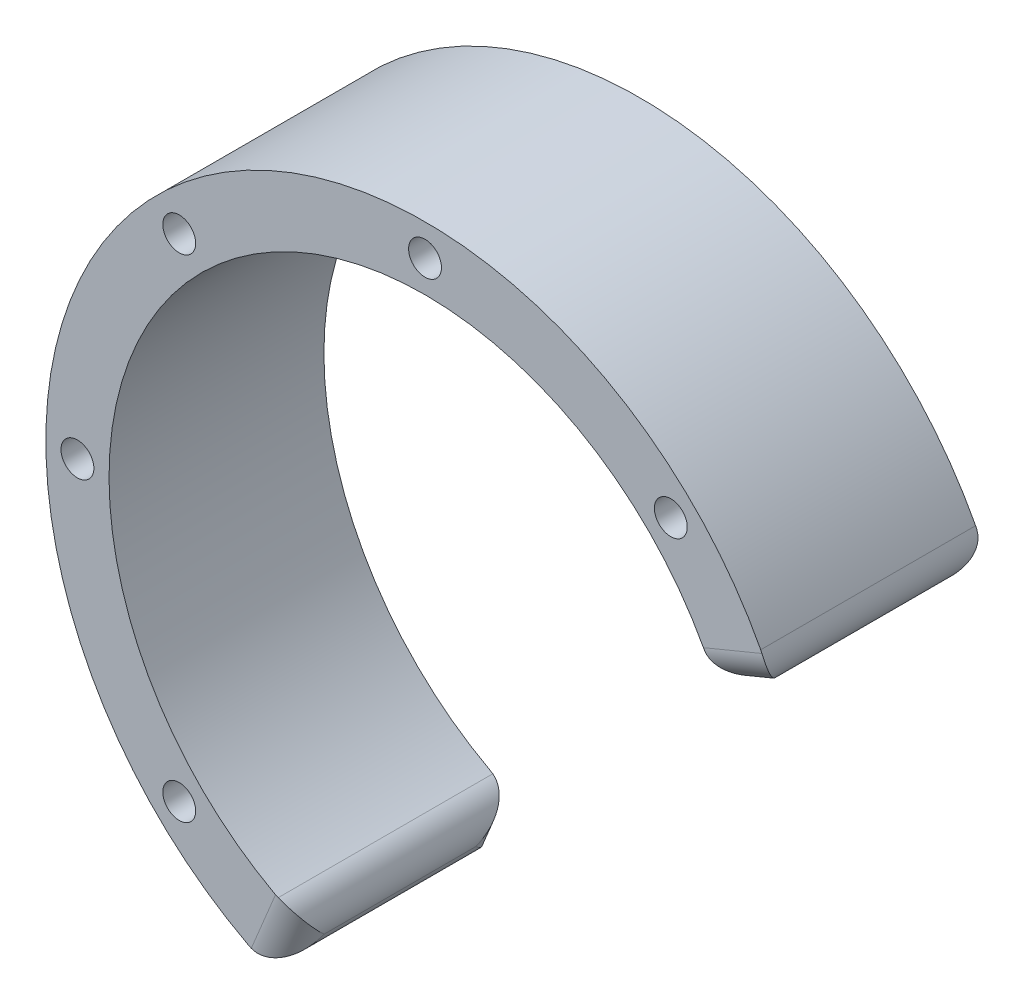
ISO-10303-21;
HEADER;
FILE_DESCRIPTION(('STEP AP214'),'2;1');
FILE_NAME('part.step','',(''),(''),'','','');
FILE_SCHEMA(('AUTOMOTIVE_DESIGN { 1 0 10303 214 1 1 1 1 }'));
ENDSEC;
DATA;
#1=APPLICATION_CONTEXT('core data for automotive mechanical design processes');
#2=APPLICATION_PROTOCOL_DEFINITION('international standard','automotive_design',2000,#1);
#3=PRODUCT_CONTEXT('',#1,'mechanical');
#4=PRODUCT('Part','Part','',(#3));
#5=PRODUCT_RELATED_PRODUCT_CATEGORY('part','',(#4));
#6=PRODUCT_DEFINITION_FORMATION('','',#4);
#7=PRODUCT_DEFINITION_CONTEXT('part definition',#1,'design');
#8=PRODUCT_DEFINITION('design','',#6,#7);
#9=PRODUCT_DEFINITION_SHAPE('','',#8);
#10=(LENGTH_UNIT() NAMED_UNIT(*) SI_UNIT(.MILLI.,.METRE.));
#11=(NAMED_UNIT(*) PLANE_ANGLE_UNIT() SI_UNIT($,.RADIAN.));
#12=(NAMED_UNIT(*) SI_UNIT($,.STERADIAN.) SOLID_ANGLE_UNIT());
#13=UNCERTAINTY_MEASURE_WITH_UNIT(LENGTH_MEASURE(1.E-05),#10,'distance_accuracy_value','');
#14=(GEOMETRIC_REPRESENTATION_CONTEXT(3) GLOBAL_UNCERTAINTY_ASSIGNED_CONTEXT((#13)) GLOBAL_UNIT_ASSIGNED_CONTEXT((#10,
#11,#12)) REPRESENTATION_CONTEXT('',''));
#15=CARTESIAN_POINT('',(0.,0.,0.));
#16=DIRECTION('',(0.,0.,1.));
#17=DIRECTION('',(1.,0.,0.));
#18=AXIS2_PLACEMENT_3D('',#15,#16,#17);
#19=CARTESIAN_POINT('',(0.,0.,34.));
#20=DIRECTION('',(0.,0.,1.));
#21=DIRECTION('',(1.,0.,0.));
#22=AXIS2_PLACEMENT_3D('',#19,#20,#21);
#23=PLANE('',#22);
#24=CARTESIAN_POINT('',(-55.,0.,34.));
#25=DIRECTION('',(0.,0.,1.));
#26=DIRECTION('',(1.,0.,0.));
#27=AXIS2_PLACEMENT_3D('',#24,#25,#26);
#28=CIRCLE('',#27,2.6);
#29=CARTESIAN_POINT('',(-52.4,0.,34.));
#30=VERTEX_POINT('',#29);
#31=EDGE_CURVE('E267',#30,#30,#28,.T.);
#32=ORIENTED_EDGE('',*,*,#31,.F.);
#33=EDGE_LOOP('',(#32));
#34=FACE_BOUND('',#33,.T.);
#35=CARTESIAN_POINT('',(0.,55.,34.));
#36=DIRECTION('',(0.,0.,1.));
#37=DIRECTION('',(1.,0.,0.));
#38=AXIS2_PLACEMENT_3D('',#35,#36,#37);
#39=CIRCLE('',#38,2.6);
#40=CARTESIAN_POINT('',(2.6,55.,34.));
#41=VERTEX_POINT('',#40);
#42=EDGE_CURVE('E148',#41,#41,#39,.T.);
#43=ORIENTED_EDGE('',*,*,#42,.F.);
#44=EDGE_LOOP('',(#43));
#45=FACE_BOUND('',#44,.T.);
#46=CARTESIAN_POINT('',(38.8908729652601,38.8908729652601,34.));
#47=DIRECTION('',(0.,0.,1.));
#48=DIRECTION('',(1.,0.,0.));
#49=AXIS2_PLACEMENT_3D('',#46,#47,#48);
#50=CIRCLE('',#49,2.6);
#51=CARTESIAN_POINT('',(41.4908729652601,38.8908729652601,34.));
#52=VERTEX_POINT('',#51);
#53=EDGE_CURVE('E215',#52,#52,#50,.T.);
#54=ORIENTED_EDGE('',*,*,#53,.F.);
#55=EDGE_LOOP('',(#54));
#56=FACE_BOUND('',#55,.T.);
#57=CARTESIAN_POINT('',(-38.8908729652601,-38.8908729652601,34.));
#58=DIRECTION('',(0.,0.,1.));
#59=DIRECTION('',(1.,0.,0.));
#60=AXIS2_PLACEMENT_3D('',#57,#58,#59);
#61=CIRCLE('',#60,2.6);
#62=CARTESIAN_POINT('',(-36.2908729652601,-38.8908729652601,34.));
#63=VERTEX_POINT('',#62);
#64=EDGE_CURVE('E200',#63,#63,#61,.T.);
#65=ORIENTED_EDGE('',*,*,#64,.F.);
#66=EDGE_LOOP('',(#65));
#67=FACE_BOUND('',#66,.T.);
#68=CARTESIAN_POINT('',(-38.8908729652601,38.8908729652601,34.));
#69=DIRECTION('',(0.,0.,1.));
#70=DIRECTION('',(1.,0.,0.));
#71=AXIS2_PLACEMENT_3D('',#68,#69,#70);
#72=CIRCLE('',#71,2.6);
#73=CARTESIAN_POINT('',(-36.2908729652601,38.8908729652601,34.));
#74=VERTEX_POINT('',#73);
#75=EDGE_CURVE('E163',#74,#74,#72,.T.);
#76=ORIENTED_EDGE('',*,*,#75,.F.);
#77=EDGE_LOOP('',(#76));
#78=FACE_BOUND('',#77,.T.);
#79=DIRECTION('',(0.923879532511288,0.382683432365087,0.));
#80=VECTOR('',#79,1.);
#81=CARTESIAN_POINT('',(-1.91341716182544,4.61939766255644,34.));
#82=LINE('',#81,#80);
#83=CARTESIAN_POINT('',(44.049009250608,23.6576580421616,34.));
#84=VERTEX_POINT('',#83);
#85=CARTESIAN_POINT('',(53.308946538107,27.493249653368,34.));
#86=VERTEX_POINT('',#85);
#87=EDGE_CURVE('E171',#84,#86,#82,.T.);
#88=ORIENTED_EDGE('',*,*,#87,.T.);
#89=CARTESIAN_POINT('',(48.6895488755505,25.5798324915425,34.));
#90=DIRECTION('',(0.,0.,1.));
#91=DIRECTION('',(1.,0.,0.));
#92=AXIS2_PLACEMENT_3D('',#89,#90,#91);
#93=CIRCLE('',#92,5.);
#94=CARTESIAN_POINT('',(53.1158715006006,27.9052718089555,34.));
#95=VERTEX_POINT('',#94);
#96=EDGE_CURVE('E211',#86,#95,#93,.T.);
#97=ORIENTED_EDGE('',*,*,#96,.T.);
#98=CARTESIAN_POINT('',(0.,0.,34.));
#99=DIRECTION('',(0.,0.,1.));
#100=DIRECTION('',(1.,0.,0.));
#101=AXIS2_PLACEMENT_3D('',#98,#99,#100);
#102=CIRCLE('',#101,60.);
#103=CARTESIAN_POINT('',(-27.9052718089557,-53.1158715006005,34.));
#104=VERTEX_POINT('',#103);
#105=EDGE_CURVE('E197',#95,#104,#102,.T.);
#106=ORIENTED_EDGE('',*,*,#105,.T.);
#107=CARTESIAN_POINT('',(-25.5798324915427,-48.6895488755505,34.));
#108=DIRECTION('',(0.,0.,1.));
#109=DIRECTION('',(1.,0.,0.));
#110=AXIS2_PLACEMENT_3D('',#107,#108,#109);
#111=CIRCLE('',#110,5.);
#112=CARTESIAN_POINT('',(-27.4932496533681,-53.3089465381069,34.));
#113=VERTEX_POINT('',#112);
#114=EDGE_CURVE('E168',#104,#113,#111,.T.);
#115=ORIENTED_EDGE('',*,*,#114,.T.);
#116=DIRECTION('',(-0.382683432365091,-0.923879532511287,0.));
#117=VECTOR('',#116,1.);
#118=CARTESIAN_POINT('',(-23.753569280811,-44.2805594637389,34.));
#119=LINE('',#118,#117);
#120=CARTESIAN_POINT('',(-23.6576580421617,-44.0490092506079,34.));
#121=VERTEX_POINT('',#120);
#122=EDGE_CURVE('E172',#113,#121,#119,.F.);
#123=ORIENTED_EDGE('',*,*,#122,.T.);
#124=CARTESIAN_POINT('',(0.,0.,34.));
#125=DIRECTION('',(0.,0.,1.));
#126=DIRECTION('',(1.,0.,0.));
#127=AXIS2_PLACEMENT_3D('',#124,#125,#126);
#128=CIRCLE('',#127,50.);
#129=EDGE_CURVE('E164',#84,#121,#128,.T.);
#130=ORIENTED_EDGE('',*,*,#129,.F.);
#131=EDGE_LOOP('',(#88,#97,#106,#115,#123,#130));
#132=FACE_BOUND('',#131,.T.);
#133=ADVANCED_FACE('F47',(#34,#45,#56,#67,#78,#132),#23,.T.);
#134=CARTESIAN_POINT('',(0.,0.,0.));
#135=DIRECTION('',(0.,0.,1.));
#136=DIRECTION('',(1.,0.,0.));
#137=AXIS2_PLACEMENT_3D('',#134,#135,#136);
#138=PLANE('',#137);
#139=CARTESIAN_POINT('',(-38.8908729652601,38.8908729652601,0.));
#140=DIRECTION('',(0.,0.,1.));
#141=DIRECTION('',(1.,0.,0.));
#142=AXIS2_PLACEMENT_3D('',#139,#140,#141);
#143=CIRCLE('',#142,2.6);
#144=CARTESIAN_POINT('',(-36.2908729652601,38.8908729652601,0.));
#145=VERTEX_POINT('',#144);
#146=EDGE_CURVE('E159',#145,#145,#143,.T.);
#147=ORIENTED_EDGE('',*,*,#146,.T.);
#148=EDGE_LOOP('',(#147));
#149=FACE_BOUND('',#148,.T.);
#150=CARTESIAN_POINT('',(-55.,0.,0.));
#151=DIRECTION('',(0.,0.,1.));
#152=DIRECTION('',(1.,0.,0.));
#153=AXIS2_PLACEMENT_3D('',#150,#151,#152);
#154=CIRCLE('',#153,2.6);
#155=CARTESIAN_POINT('',(-52.4,0.,0.));
#156=VERTEX_POINT('',#155);
#157=EDGE_CURVE('E265',#156,#156,#154,.T.);
#158=ORIENTED_EDGE('',*,*,#157,.T.);
#159=EDGE_LOOP('',(#158));
#160=FACE_BOUND('',#159,.T.);
#161=CARTESIAN_POINT('',(-38.8908729652601,-38.8908729652601,0.));
#162=DIRECTION('',(0.,0.,1.));
#163=DIRECTION('',(1.,0.,0.));
#164=AXIS2_PLACEMENT_3D('',#161,#162,#163);
#165=CIRCLE('',#164,2.6);
#166=CARTESIAN_POINT('',(-36.2908729652601,-38.8908729652601,0.));
#167=VERTEX_POINT('',#166);
#168=EDGE_CURVE('E205',#167,#167,#165,.T.);
#169=ORIENTED_EDGE('',*,*,#168,.T.);
#170=EDGE_LOOP('',(#169));
#171=FACE_BOUND('',#170,.T.);
#172=CARTESIAN_POINT('',(38.8908729652601,38.8908729652601,0.));
#173=DIRECTION('',(0.,0.,1.));
#174=DIRECTION('',(1.,0.,0.));
#175=AXIS2_PLACEMENT_3D('',#172,#173,#174);
#176=CIRCLE('',#175,2.6);
#177=CARTESIAN_POINT('',(41.4908729652601,38.8908729652601,0.));
#178=VERTEX_POINT('',#177);
#179=EDGE_CURVE('E204',#178,#178,#176,.T.);
#180=ORIENTED_EDGE('',*,*,#179,.T.);
#181=EDGE_LOOP('',(#180));
#182=FACE_BOUND('',#181,.T.);
#183=CARTESIAN_POINT('',(0.,55.,0.));
#184=DIRECTION('',(0.,0.,1.));
#185=DIRECTION('',(1.,0.,0.));
#186=AXIS2_PLACEMENT_3D('',#183,#184,#185);
#187=CIRCLE('',#186,2.6);
#188=CARTESIAN_POINT('',(2.6,55.,0.));
#189=VERTEX_POINT('',#188);
#190=EDGE_CURVE('E152',#189,#189,#187,.T.);
#191=ORIENTED_EDGE('',*,*,#190,.T.);
#192=EDGE_LOOP('',(#191));
#193=FACE_BOUND('',#192,.T.);
#194=CARTESIAN_POINT('',(0.,0.,0.));
#195=DIRECTION('',(0.,0.,1.));
#196=DIRECTION('',(1.,0.,0.));
#197=AXIS2_PLACEMENT_3D('',#194,#195,#196);
#198=CIRCLE('',#197,60.);
#199=CARTESIAN_POINT('',(53.1158715006006,27.9052718089555,0.));
#200=VERTEX_POINT('',#199);
#201=CARTESIAN_POINT('',(-27.9052718089557,-53.1158715006005,0.));
#202=VERTEX_POINT('',#201);
#203=EDGE_CURVE('E151',#200,#202,#198,.T.);
#204=ORIENTED_EDGE('',*,*,#203,.F.);
#205=CARTESIAN_POINT('',(48.6895488755505,25.5798324915425,0.));
#206=DIRECTION('',(0.,0.,1.));
#207=DIRECTION('',(1.,0.,0.));
#208=AXIS2_PLACEMENT_3D('',#205,#206,#207);
#209=CIRCLE('',#208,5.);
#210=CARTESIAN_POINT('',(53.308946538107,27.493249653368,0.));
#211=VERTEX_POINT('',#210);
#212=EDGE_CURVE('E139',#200,#211,#209,.F.);
#213=ORIENTED_EDGE('',*,*,#212,.T.);
#214=DIRECTION('',(0.923879532511288,0.382683432365087,0.));
#215=VECTOR('',#214,1.);
#216=CARTESIAN_POINT('',(44.280559463739,23.7535692808108,0.));
#217=LINE('',#216,#215);
#218=CARTESIAN_POINT('',(44.049009250608,23.6576580421616,0.));
#219=VERTEX_POINT('',#218);
#220=EDGE_CURVE('E144',#211,#219,#217,.F.);
#221=ORIENTED_EDGE('',*,*,#220,.T.);
#222=CARTESIAN_POINT('',(0.,0.,0.));
#223=DIRECTION('',(0.,0.,1.));
#224=DIRECTION('',(1.,0.,0.));
#225=AXIS2_PLACEMENT_3D('',#222,#223,#224);
#226=CIRCLE('',#225,50.);
#227=CARTESIAN_POINT('',(-23.6576580421617,-44.0490092506079,0.));
#228=VERTEX_POINT('',#227);
#229=EDGE_CURVE('E243',#219,#228,#226,.T.);
#230=ORIENTED_EDGE('',*,*,#229,.T.);
#231=DIRECTION('',(-0.382683432365091,-0.923879532511287,0.));
#232=VECTOR('',#231,1.);
#233=CARTESIAN_POINT('',(-4.61939766255643,1.91341716182545,0.));
#234=LINE('',#233,#232);
#235=CARTESIAN_POINT('',(-27.4932496533681,-53.3089465381069,0.));
#236=VERTEX_POINT('',#235);
#237=EDGE_CURVE('E287',#228,#236,#234,.T.);
#238=ORIENTED_EDGE('',*,*,#237,.T.);
#239=CARTESIAN_POINT('',(-25.5798324915427,-48.6895488755505,0.));
#240=DIRECTION('',(0.,0.,1.));
#241=DIRECTION('',(1.,0.,0.));
#242=AXIS2_PLACEMENT_3D('',#239,#240,#241);
#243=CIRCLE('',#242,5.);
#244=EDGE_CURVE('E98',#236,#202,#243,.F.);
#245=ORIENTED_EDGE('',*,*,#244,.T.);
#246=EDGE_LOOP('',(#204,#213,#221,#230,#238,#245));
#247=FACE_BOUND('',#246,.T.);
#248=ADVANCED_FACE('F310',(#149,#160,#171,#182,#193,#247),#138,.F.);
#249=CARTESIAN_POINT('',(0.,0.,34.));
#250=DIRECTION('',(0.,0.,-1.));
#251=DIRECTION('',(-1.,0.,0.));
#252=AXIS2_PLACEMENT_3D('',#249,#250,#251);
#253=CYLINDRICAL_SURFACE('',#252,60.);
#254=ORIENTED_EDGE('',*,*,#105,.F.);
#255=DIRECTION('',(0.,0.,-1.));
#256=VECTOR('',#255,1.);
#257=CARTESIAN_POINT('',(53.1158715006006,27.9052718089555,34.));
#258=LINE('',#257,#256);
#259=EDGE_CURVE('E131',#95,#200,#258,.T.);
#260=ORIENTED_EDGE('',*,*,#259,.T.);
#261=ORIENTED_EDGE('',*,*,#203,.T.);
#262=DIRECTION('',(0.,0.,-1.));
#263=VECTOR('',#262,1.);
#264=CARTESIAN_POINT('',(-27.9052718089557,-53.1158715006005,34.));
#265=LINE('',#264,#263);
#266=EDGE_CURVE('E135',#202,#104,#265,.F.);
#267=ORIENTED_EDGE('',*,*,#266,.T.);
#268=EDGE_LOOP('',(#254,#260,#261,#267));
#269=FACE_BOUND('',#268,.T.);
#270=ADVANCED_FACE('F316',(#269),#253,.T.);
#271=CARTESIAN_POINT('',(0.,0.,34.));
#272=DIRECTION('',(0.,0.,-1.));
#273=DIRECTION('',(-1.,0.,0.));
#274=AXIS2_PLACEMENT_3D('',#271,#272,#273);
#275=CYLINDRICAL_SURFACE('',#274,50.);
#276=ORIENTED_EDGE('',*,*,#229,.F.);
#277=CARTESIAN_POINT('',(44.049009250608,23.6576580421616,0.));
#278=CARTESIAN_POINT('',(44.0850923837166,23.5904720987774,2.14972934691426E-07));
#279=CARTESIAN_POINT('',(44.1209853669286,23.5232737214159,0.00172565768276111));
#280=CARTESIAN_POINT('',(44.1923910335594,23.3888520987386,0.00862699857619739));
#281=CARTESIAN_POINT('',(44.2279037169783,23.3216288534227,0.0138028967598073));
#282=CARTESIAN_POINT('',(44.2632262505005,23.2543931741296,0.0207040226803089));
#283=B_SPLINE_CURVE_WITH_KNOTS('',3,(#277,#278,#279,#280,#281,#282),.UNSPECIFIED.,.F.,.F.,(4,2,
4),(0.,0.228609159588416,0.457218319176832),.UNSPECIFIED.);
#284=CARTESIAN_POINT('',(44.2632262505005,23.2543931741296,0.0207040226803054));
#285=VERTEX_POINT('',#284);
#286=EDGE_CURVE('E11',#219,#285,#283,.T.);
#287=ORIENTED_EDGE('',*,*,#286,.T.);
#288=DIRECTION('',(0.,0.,-1.));
#289=VECTOR('',#288,1.);
#290=CARTESIAN_POINT('',(44.2632262505005,23.2543931741296,34.));
#291=LINE('',#290,#289);
#292=CARTESIAN_POINT('',(44.2632262505005,23.2543931741296,33.9792959773197));
#293=VERTEX_POINT('',#292);
#294=EDGE_CURVE('E59',#285,#293,#291,.F.);
#295=ORIENTED_EDGE('',*,*,#294,.T.);
#296=CARTESIAN_POINT('',(44.2632262505005,23.2543931741296,33.9792959773197));
#297=CARTESIAN_POINT('',(44.2279037169783,23.3216288534227,33.9861971032402));
#298=CARTESIAN_POINT('',(44.1923910335594,23.3888520987386,33.9913730014238));
#299=CARTESIAN_POINT('',(44.1209853669286,23.5232737214159,33.9982743423172));
#300=CARTESIAN_POINT('',(44.0850923837166,23.5904720987774,33.9999997850271));
#301=CARTESIAN_POINT('',(44.049009250608,23.6576580421616,34.));
#302=B_SPLINE_CURVE_WITH_KNOTS('',3,(#296,#297,#298,#299,#300,#301),.UNSPECIFIED.,.F.,.F.,(4,2,
4),(0.,0.228609159588414,0.45721831917683),.UNSPECIFIED.);
#303=EDGE_CURVE('E128',#293,#84,#302,.T.);
#304=ORIENTED_EDGE('',*,*,#303,.T.);
#305=ORIENTED_EDGE('',*,*,#129,.T.);
#306=CARTESIAN_POINT('',(-23.6576580421617,-44.0490092506079,34.));
#307=CARTESIAN_POINT('',(-23.5904720987775,-44.0850923837165,33.9999997850271));
#308=CARTESIAN_POINT('',(-23.5232737214161,-44.1209853669285,33.9982743423172));
#309=CARTESIAN_POINT('',(-23.3888520987387,-44.1923910335594,33.9913730014238));
#310=CARTESIAN_POINT('',(-23.3216288534228,-44.2279037169782,33.9861971032402));
#311=CARTESIAN_POINT('',(-23.2543931741297,-44.2632262505004,33.9792959773197));
#312=B_SPLINE_CURVE_WITH_KNOTS('',3,(#306,#307,#308,#309,#310,#311),.UNSPECIFIED.,.F.,.F.,(4,2,
4),(0.,0.228609159588419,0.457218319176836),.UNSPECIFIED.);
#313=CARTESIAN_POINT('',(-23.2543931741297,-44.2632262505004,33.9792959773197));
#314=VERTEX_POINT('',#313);
#315=EDGE_CURVE('E143',#121,#314,#312,.T.);
#316=ORIENTED_EDGE('',*,*,#315,.T.);
#317=DIRECTION('',(0.,0.,-1.));
#318=VECTOR('',#317,1.);
#319=CARTESIAN_POINT('',(-23.2543931741297,-44.2632262505004,34.));
#320=LINE('',#319,#318);
#321=CARTESIAN_POINT('',(-23.2543931741297,-44.2632262505004,0.0207040226803054));
#322=VERTEX_POINT('',#321);
#323=EDGE_CURVE('E180',#314,#322,#320,.T.);
#324=ORIENTED_EDGE('',*,*,#323,.T.);
#325=CARTESIAN_POINT('',(-23.2543931741297,-44.2632262505004,0.0207040226803054));
#326=CARTESIAN_POINT('',(-23.3216288534228,-44.2279037169782,0.0138028967598055));
#327=CARTESIAN_POINT('',(-23.3888520987387,-44.1923910335594,0.00862699857619675));
#328=CARTESIAN_POINT('',(-23.5232737214161,-44.1209853669285,0.00172565768276146));
#329=CARTESIAN_POINT('',(-23.5904720987775,-44.0850923837165,2.14972935010914E-07));
#330=CARTESIAN_POINT('',(-23.6576580421617,-44.0490092506079,0.));
#331=B_SPLINE_CURVE_WITH_KNOTS('',3,(#325,#326,#327,#328,#329,#330),.UNSPECIFIED.,.F.,.F.,(4,2,
4),(0.,0.228609159588413,0.457218319176832),.UNSPECIFIED.);
#332=EDGE_CURVE('E107',#322,#228,#331,.T.);
#333=ORIENTED_EDGE('',*,*,#332,.T.);
#334=EDGE_LOOP('',(#276,#287,#295,#304,#305,#316,#324,#333));
#335=FACE_BOUND('',#334,.T.);
#336=ADVANCED_FACE('F297',(#335),#275,.F.);
#337=CARTESIAN_POINT('',(0.,55.,34.));
#338=DIRECTION('',(0.,0.,-1.));
#339=DIRECTION('',(-1.,0.,0.));
#340=AXIS2_PLACEMENT_3D('',#337,#338,#339);
#341=CYLINDRICAL_SURFACE('',#340,2.6);
#342=ORIENTED_EDGE('',*,*,#42,.T.);
#343=EDGE_LOOP('',(#342));
#344=FACE_BOUND('',#343,.T.);
#345=ORIENTED_EDGE('',*,*,#190,.F.);
#346=EDGE_LOOP('',(#345));
#347=FACE_BOUND('',#346,.T.);
#348=ADVANCED_FACE('F322',(#344,#347),#341,.F.);
#349=CARTESIAN_POINT('',(38.8908729652601,38.8908729652601,34.));
#350=DIRECTION('',(0.,0.,-1.));
#351=DIRECTION('',(-1.,0.,0.));
#352=AXIS2_PLACEMENT_3D('',#349,#350,#351);
#353=CYLINDRICAL_SURFACE('',#352,2.6);
#354=ORIENTED_EDGE('',*,*,#53,.T.);
#355=EDGE_LOOP('',(#354));
#356=FACE_BOUND('',#355,.T.);
#357=ORIENTED_EDGE('',*,*,#179,.F.);
#358=EDGE_LOOP('',(#357));
#359=FACE_BOUND('',#358,.T.);
#360=ADVANCED_FACE('F402',(#356,#359),#353,.F.);
#361=CARTESIAN_POINT('',(-38.8908729652601,-38.8908729652601,34.));
#362=DIRECTION('',(0.,0.,-1.));
#363=DIRECTION('',(-1.,0.,0.));
#364=AXIS2_PLACEMENT_3D('',#361,#362,#363);
#365=CYLINDRICAL_SURFACE('',#364,2.6);
#366=ORIENTED_EDGE('',*,*,#64,.T.);
#367=EDGE_LOOP('',(#366));
#368=FACE_BOUND('',#367,.T.);
#369=ORIENTED_EDGE('',*,*,#168,.F.);
#370=EDGE_LOOP('',(#369));
#371=FACE_BOUND('',#370,.T.);
#372=ADVANCED_FACE('F396',(#368,#371),#365,.F.);
#373=CARTESIAN_POINT('',(-55.,0.,34.));
#374=DIRECTION('',(0.,0.,-1.));
#375=DIRECTION('',(-1.,0.,0.));
#376=AXIS2_PLACEMENT_3D('',#373,#374,#375);
#377=CYLINDRICAL_SURFACE('',#376,2.6);
#378=ORIENTED_EDGE('',*,*,#31,.T.);
#379=EDGE_LOOP('',(#378));
#380=FACE_BOUND('',#379,.T.);
#381=ORIENTED_EDGE('',*,*,#157,.F.);
#382=EDGE_LOOP('',(#381));
#383=FACE_BOUND('',#382,.T.);
#384=ADVANCED_FACE('F390',(#380,#383),#377,.F.);
#385=CARTESIAN_POINT('',(-38.8908729652601,38.8908729652601,34.));
#386=DIRECTION('',(0.,0.,-1.));
#387=DIRECTION('',(-1.,0.,0.));
#388=AXIS2_PLACEMENT_3D('',#385,#386,#387);
#389=CYLINDRICAL_SURFACE('',#388,2.6);
#390=ORIENTED_EDGE('',*,*,#75,.T.);
#391=EDGE_LOOP('',(#390));
#392=FACE_BOUND('',#391,.T.);
#393=ORIENTED_EDGE('',*,*,#146,.F.);
#394=EDGE_LOOP('',(#393));
#395=FACE_BOUND('',#394,.T.);
#396=ADVANCED_FACE('F385',(#392,#395),#389,.F.);
#397=CARTESIAN_POINT('',(-1.91341716182544,4.61939766255644,5.));
#398=DIRECTION('',(-0.923879532511288,-0.382683432365087,0.));
#399=DIRECTION('',(0.382683432365087,-0.923879532511288,0.));
#400=AXIS2_PLACEMENT_3D('',#397,#398,#399);
#401=CYLINDRICAL_SURFACE('',#400,5.);
#402=CARTESIAN_POINT('',(48.6895488755505,25.5798324915425,5.));
#403=DIRECTION('',(0.653281482438189,0.270598050073097,-0.707106781186547));
#404=DIRECTION('',(-0.653281482438189,-0.270598050073097,-0.707106781186547));
#405=AXIS2_PLACEMENT_3D('',#402,#403,#404);
#406=ELLIPSE('',#405,7.07106781186547,5.);
#407=CARTESIAN_POINT('',(50.602966037376,20.9604348289861,5.));
#408=VERTEX_POINT('',#407);
#409=EDGE_CURVE('E241',#285,#408,#406,.F.);
#410=ORIENTED_EDGE('',*,*,#409,.F.);
#411=ORIENTED_EDGE('',*,*,#286,.F.);
#412=ORIENTED_EDGE('',*,*,#220,.F.);
#413=CARTESIAN_POINT('',(48.6895488755505,25.5798324915425,5.));
#414=DIRECTION('',(-0.653281482438189,-0.270598050073097,-0.707106781186547));
#415=DIRECTION('',(-0.653281482438189,-0.270598050073097,0.707106781186547));
#416=AXIS2_PLACEMENT_3D('',#413,#414,#415);
#417=ELLIPSE('',#416,7.07106781186547,5.);
#418=EDGE_CURVE('E183',#408,#211,#417,.F.);
#419=ORIENTED_EDGE('',*,*,#418,.F.);
#420=EDGE_LOOP('',(#410,#411,#412,#419));
#421=FACE_BOUND('',#420,.T.);
#422=ADVANCED_FACE('F383',(#421),#401,.T.);
#423=CARTESIAN_POINT('',(48.6895488755505,25.5798324915425,34.));
#424=DIRECTION('',(0.,0.,-1.));
#425=DIRECTION('',(-1.,0.,0.));
#426=AXIS2_PLACEMENT_3D('',#423,#424,#425);
#427=CYLINDRICAL_SURFACE('',#426,5.);
#428=CARTESIAN_POINT('',(48.6895488755505,25.5798324915425,29.));
#429=DIRECTION('',(0.653281482438189,0.270598050073097,0.707106781186547));
#430=DIRECTION('',(0.653281482438189,0.270598050073097,-0.707106781186547));
#431=AXIS2_PLACEMENT_3D('',#428,#429,#430);
#432=ELLIPSE('',#431,7.07106781186547,5.);
#433=CARTESIAN_POINT('',(50.602966037376,20.9604348289861,29.));
#434=VERTEX_POINT('',#433);
#435=EDGE_CURVE('E187',#293,#434,#432,.T.);
#436=ORIENTED_EDGE('',*,*,#435,.F.);
#437=ORIENTED_EDGE('',*,*,#294,.F.);
#438=ORIENTED_EDGE('',*,*,#409,.T.);
#439=DIRECTION('',(0.,0.,-1.));
#440=VECTOR('',#439,1.);
#441=CARTESIAN_POINT('',(50.602966037376,20.9604348289861,0.));
#442=LINE('',#441,#440);
#443=EDGE_CURVE('E188',#434,#408,#442,.T.);
#444=ORIENTED_EDGE('',*,*,#443,.F.);
#445=EDGE_LOOP('',(#436,#437,#438,#444));
#446=FACE_BOUND('',#445,.T.);
#447=ADVANCED_FACE('F334',(#446),#427,.T.);
#448=CARTESIAN_POINT('',(-1.91341716182544,4.61939766255644,29.));
#449=DIRECTION('',(0.923879532511288,0.382683432365087,0.));
#450=DIRECTION('',(-0.382683432365087,0.923879532511288,0.));
#451=AXIS2_PLACEMENT_3D('',#448,#449,#450);
#452=CYLINDRICAL_SURFACE('',#451,5.);
#453=ORIENTED_EDGE('',*,*,#303,.F.);
#454=ORIENTED_EDGE('',*,*,#435,.T.);
#455=CARTESIAN_POINT('',(48.6895488755505,25.5798324915425,29.));
#456=DIRECTION('',(0.653281482438189,0.270598050073097,-0.707106781186547));
#457=DIRECTION('',(0.653281482438189,0.270598050073097,0.707106781186547));
#458=AXIS2_PLACEMENT_3D('',#455,#456,#457);
#459=ELLIPSE('',#458,7.07106781186547,5.);
#460=EDGE_CURVE('E102',#86,#434,#459,.T.);
#461=ORIENTED_EDGE('',*,*,#460,.F.);
#462=ORIENTED_EDGE('',*,*,#87,.F.);
#463=EDGE_LOOP('',(#453,#454,#461,#462));
#464=FACE_BOUND('',#463,.T.);
#465=ADVANCED_FACE('F330',(#464),#452,.T.);
#466=CARTESIAN_POINT('',(48.6895488755505,25.5798324915425,34.));
#467=DIRECTION('',(0.,0.,-1.));
#468=DIRECTION('',(-1.,0.,0.));
#469=AXIS2_PLACEMENT_3D('',#466,#467,#468);
#470=CYLINDRICAL_SURFACE('',#469,5.);
#471=ORIENTED_EDGE('',*,*,#212,.F.);
#472=ORIENTED_EDGE('',*,*,#259,.F.);
#473=ORIENTED_EDGE('',*,*,#96,.F.);
#474=ORIENTED_EDGE('',*,*,#460,.T.);
#475=ORIENTED_EDGE('',*,*,#443,.T.);
#476=ORIENTED_EDGE('',*,*,#418,.T.);
#477=EDGE_LOOP('',(#471,#472,#473,#474,#475,#476));
#478=FACE_BOUND('',#477,.T.);
#479=ADVANCED_FACE('F308',(#478),#470,.T.);
#480=CARTESIAN_POINT('',(-4.61939766255643,1.91341716182545,5.));
#481=DIRECTION('',(-0.382683432365091,-0.923879532511287,0.));
#482=DIRECTION('',(0.923879532511287,-0.382683432365091,0.));
#483=AXIS2_PLACEMENT_3D('',#480,#481,#482);
#484=CYLINDRICAL_SURFACE('',#483,5.);
#485=CARTESIAN_POINT('',(-25.5798324915427,-48.6895488755505,5.));
#486=DIRECTION('',(0.270598050073099,0.653281482438188,-0.707106781186547));
#487=DIRECTION('',(-0.270598050073099,-0.653281482438188,-0.707106781186547));
#488=AXIS2_PLACEMENT_3D('',#485,#486,#487);
#489=ELLIPSE('',#488,7.07106781186547,5.);
#490=CARTESIAN_POINT('',(-20.9604348289863,-50.6029660373759,5.));
#491=VERTEX_POINT('',#490);
#492=EDGE_CURVE('E52',#236,#491,#489,.F.);
#493=ORIENTED_EDGE('',*,*,#492,.F.);
#494=ORIENTED_EDGE('',*,*,#237,.F.);
#495=ORIENTED_EDGE('',*,*,#332,.F.);
#496=CARTESIAN_POINT('',(-25.5798324915427,-48.6895488755505,5.));
#497=DIRECTION('',(-0.270598050073099,-0.653281482438188,-0.707106781186547));
#498=DIRECTION('',(-0.270598050073099,-0.653281482438188,0.707106781186547));
#499=AXIS2_PLACEMENT_3D('',#496,#497,#498);
#500=ELLIPSE('',#499,7.07106781186547,5.);
#501=EDGE_CURVE('E105',#491,#322,#500,.F.);
#502=ORIENTED_EDGE('',*,*,#501,.F.);
#503=EDGE_LOOP('',(#493,#494,#495,#502));
#504=FACE_BOUND('',#503,.T.);
#505=ADVANCED_FACE('F49',(#504),#484,.T.);
#506=CARTESIAN_POINT('',(-25.5798324915427,-48.6895488755505,34.));
#507=DIRECTION('',(0.,0.,-1.));
#508=DIRECTION('',(-1.,0.,0.));
#509=AXIS2_PLACEMENT_3D('',#506,#507,#508);
#510=CYLINDRICAL_SURFACE('',#509,5.);
#511=CARTESIAN_POINT('',(-25.5798324915427,-48.6895488755505,29.));
#512=DIRECTION('',(0.270598050073099,0.653281482438188,0.707106781186547));
#513=DIRECTION('',(0.270598050073099,0.653281482438188,-0.707106781186547));
#514=AXIS2_PLACEMENT_3D('',#511,#512,#513);
#515=ELLIPSE('',#514,7.07106781186547,5.);
#516=CARTESIAN_POINT('',(-20.9604348289863,-50.6029660373759,29.));
#517=VERTEX_POINT('',#516);
#518=EDGE_CURVE('E84',#113,#517,#515,.T.);
#519=ORIENTED_EDGE('',*,*,#518,.F.);
#520=ORIENTED_EDGE('',*,*,#114,.F.);
#521=ORIENTED_EDGE('',*,*,#266,.F.);
#522=ORIENTED_EDGE('',*,*,#244,.F.);
#523=ORIENTED_EDGE('',*,*,#492,.T.);
#524=DIRECTION('',(0.,0.,-1.));
#525=VECTOR('',#524,1.);
#526=CARTESIAN_POINT('',(-20.9604348289863,-50.6029660373759,0.));
#527=LINE('',#526,#525);
#528=EDGE_CURVE('E93',#517,#491,#527,.T.);
#529=ORIENTED_EDGE('',*,*,#528,.F.);
#530=EDGE_LOOP('',(#519,#520,#521,#522,#523,#529));
#531=FACE_BOUND('',#530,.T.);
#532=ADVANCED_FACE('F91',(#531),#510,.T.);
#533=CARTESIAN_POINT('',(-4.61939766255643,1.91341716182545,29.));
#534=DIRECTION('',(0.382683432365091,0.923879532511287,0.));
#535=DIRECTION('',(-0.923879532511287,0.382683432365091,0.));
#536=AXIS2_PLACEMENT_3D('',#533,#534,#535);
#537=CYLINDRICAL_SURFACE('',#536,5.);
#538=ORIENTED_EDGE('',*,*,#122,.F.);
#539=ORIENTED_EDGE('',*,*,#518,.T.);
#540=CARTESIAN_POINT('',(-25.5798324915427,-48.6895488755505,29.));
#541=DIRECTION('',(0.270598050073099,0.653281482438188,-0.707106781186547));
#542=DIRECTION('',(0.270598050073099,0.653281482438188,0.707106781186547));
#543=AXIS2_PLACEMENT_3D('',#540,#541,#542);
#544=ELLIPSE('',#543,7.07106781186547,5.);
#545=EDGE_CURVE('E114',#314,#517,#544,.T.);
#546=ORIENTED_EDGE('',*,*,#545,.F.);
#547=ORIENTED_EDGE('',*,*,#315,.F.);
#548=EDGE_LOOP('',(#538,#539,#546,#547));
#549=FACE_BOUND('',#548,.T.);
#550=ADVANCED_FACE('F300',(#549),#537,.T.);
#551=CARTESIAN_POINT('',(-25.5798324915427,-48.6895488755505,34.));
#552=DIRECTION('',(0.,0.,-1.));
#553=DIRECTION('',(-1.,0.,0.));
#554=AXIS2_PLACEMENT_3D('',#551,#552,#553);
#555=CYLINDRICAL_SURFACE('',#554,5.);
#556=ORIENTED_EDGE('',*,*,#501,.T.);
#557=ORIENTED_EDGE('',*,*,#323,.F.);
#558=ORIENTED_EDGE('',*,*,#545,.T.);
#559=ORIENTED_EDGE('',*,*,#528,.T.);
#560=EDGE_LOOP('',(#556,#557,#558,#559));
#561=FACE_BOUND('',#560,.T.);
#562=ADVANCED_FACE('F113',(#561),#555,.T.);
#563=CLOSED_SHELL('',(#133,#248,#270,#336,#348,#360,#372,#384,#396,#422,#447,#465,#479,#505,
#532,#550,#562));
#564=MANIFOLD_SOLID_BREP('B2',#563);
#565=ADVANCED_BREP_SHAPE_REPRESENTATION('',(#18,#564),#14);
#566=SHAPE_DEFINITION_REPRESENTATION(#9,#565);
ENDSEC;
END-ISO-10303-21;
